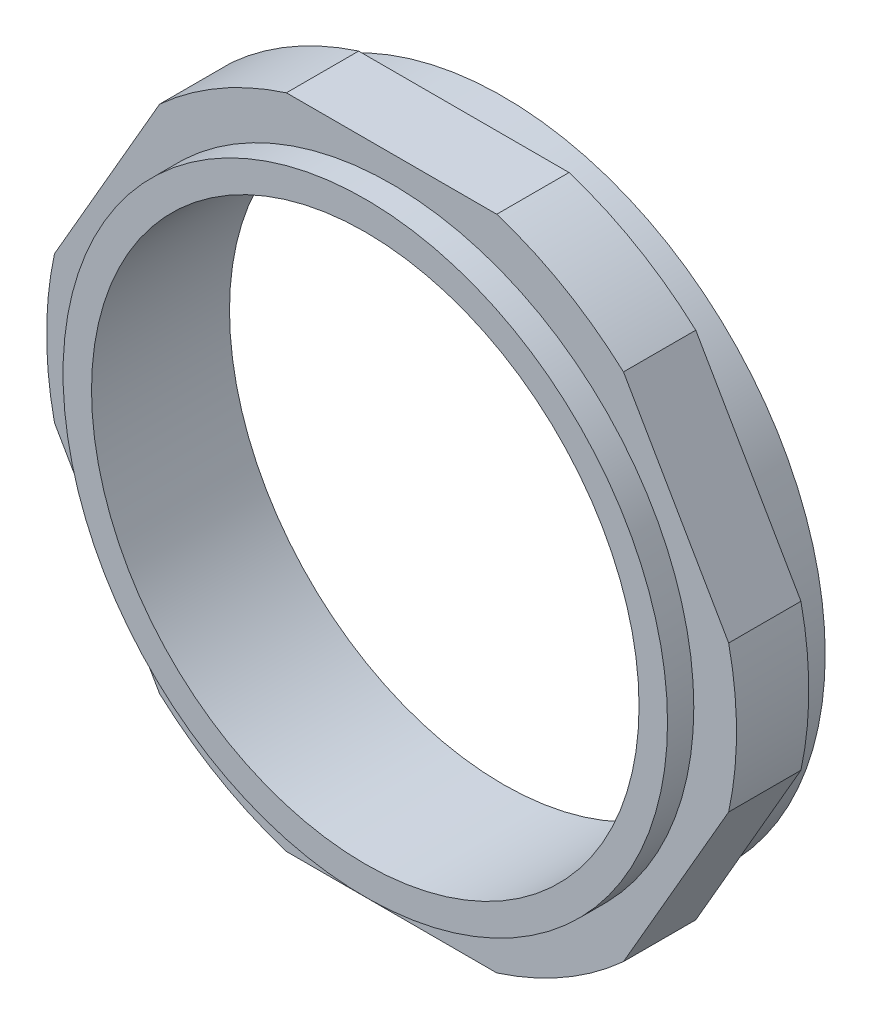
ISO-10303-21;
HEADER;
FILE_DESCRIPTION(('STEP AP214'),'2;1');
FILE_NAME('part.step','',(''),(''),'','','');
FILE_SCHEMA(('AUTOMOTIVE_DESIGN { 1 0 10303 214 1 1 1 1 }'));
ENDSEC;
DATA;
#1=APPLICATION_CONTEXT('core data for automotive mechanical design processes');
#2=APPLICATION_PROTOCOL_DEFINITION('international standard','automotive_design',2000,#1);
#3=PRODUCT_CONTEXT('',#1,'mechanical');
#4=PRODUCT('Part','Part','',(#3));
#5=PRODUCT_RELATED_PRODUCT_CATEGORY('part','',(#4));
#6=PRODUCT_DEFINITION_FORMATION('','',#4);
#7=PRODUCT_DEFINITION_CONTEXT('part definition',#1,'design');
#8=PRODUCT_DEFINITION('design','',#6,#7);
#9=PRODUCT_DEFINITION_SHAPE('','',#8);
#10=(LENGTH_UNIT() NAMED_UNIT(*) SI_UNIT(.MILLI.,.METRE.));
#11=(NAMED_UNIT(*) PLANE_ANGLE_UNIT() SI_UNIT($,.RADIAN.));
#12=(NAMED_UNIT(*) SI_UNIT($,.STERADIAN.) SOLID_ANGLE_UNIT());
#13=UNCERTAINTY_MEASURE_WITH_UNIT(LENGTH_MEASURE(1.E-05),#10,'distance_accuracy_value','');
#14=(GEOMETRIC_REPRESENTATION_CONTEXT(3) GLOBAL_UNCERTAINTY_ASSIGNED_CONTEXT((#13)) GLOBAL_UNIT_ASSIGNED_CONTEXT((#10,
#11,#12)) REPRESENTATION_CONTEXT('',''));
#15=CARTESIAN_POINT('',(0.,0.,0.));
#16=DIRECTION('',(0.,0.,1.));
#17=DIRECTION('',(1.,0.,0.));
#18=AXIS2_PLACEMENT_3D('',#15,#16,#17);
#19=CARTESIAN_POINT('',(0.,0.,1.8));
#20=DIRECTION('',(0.,0.,-1.));
#21=DIRECTION('',(1.,0.,0.));
#22=AXIS2_PLACEMENT_3D('',#19,#20,#21);
#23=CYLINDRICAL_SURFACE('',#22,29.4);
#24=CARTESIAN_POINT('',(0.,0.,0.));
#25=DIRECTION('',(0.,0.,-1.));
#26=DIRECTION('',(1.,0.,0.));
#27=AXIS2_PLACEMENT_3D('',#24,#25,#26);
#28=CIRCLE('',#27,29.4);
#29=CARTESIAN_POINT('',(29.4,0.,0.));
#30=VERTEX_POINT('',#29);
#31=EDGE_CURVE('E38',#30,#30,#28,.T.);
#32=ORIENTED_EDGE('',*,*,#31,.F.);
#33=EDGE_LOOP('',(#32));
#34=FACE_BOUND('',#33,.T.);
#35=CARTESIAN_POINT('',(0.,0.,3.6));
#36=DIRECTION('',(0.,0.,-1.));
#37=DIRECTION('',(1.,0.,0.));
#38=AXIS2_PLACEMENT_3D('',#35,#36,#37);
#39=CIRCLE('',#38,29.4);
#40=CARTESIAN_POINT('',(29.4,0.,3.6));
#41=VERTEX_POINT('',#40);
#42=EDGE_CURVE('E147',#41,#41,#39,.T.);
#43=ORIENTED_EDGE('',*,*,#42,.T.);
#44=EDGE_LOOP('',(#43));
#45=FACE_BOUND('',#44,.T.);
#46=ADVANCED_FACE('F34',(#34,#45),#23,.T.);
#47=CARTESIAN_POINT('',(0.,0.,3.6));
#48=DIRECTION('',(0.,0.,1.));
#49=DIRECTION('',(1.,0.,0.));
#50=AXIS2_PLACEMENT_3D('',#47,#48,#49);
#51=PLANE('',#50);
#52=ORIENTED_EDGE('',*,*,#42,.F.);
#53=EDGE_LOOP('',(#52));
#54=FACE_BOUND('',#53,.T.);
#55=CARTESIAN_POINT('',(0.,0.,3.6));
#56=DIRECTION('',(0.,0.,-1.));
#57=DIRECTION('',(1.,0.,0.));
#58=AXIS2_PLACEMENT_3D('',#55,#56,#57);
#59=CIRCLE('',#58,31.5);
#60=CARTESIAN_POINT('',(9.60468635614927,30.,3.6));
#61=VERTEX_POINT('',#60);
#62=CARTESIAN_POINT('',(21.1784189354586,23.317902379807,3.6));
#63=VERTEX_POINT('',#62);
#64=EDGE_CURVE('E56',#61,#63,#59,.T.);
#65=ORIENTED_EDGE('',*,*,#64,.T.);
#66=DIRECTION('',(-0.5,0.866025403784439,0.));
#67=VECTOR('',#66,1.);
#68=CARTESIAN_POINT('',(34.6410161513776,0.,3.6));
#69=LINE('',#68,#67);
#70=CARTESIAN_POINT('',(30.7831052916078,6.68209762019298,3.6));
#71=VERTEX_POINT('',#70);
#72=EDGE_CURVE('E245',#71,#63,#69,.T.);
#73=ORIENTED_EDGE('',*,*,#72,.F.);
#74=CARTESIAN_POINT('',(0.,0.,3.6));
#75=DIRECTION('',(0.,0.,-1.));
#76=DIRECTION('',(1.,0.,0.));
#77=AXIS2_PLACEMENT_3D('',#74,#75,#76);
#78=CIRCLE('',#77,31.5);
#79=CARTESIAN_POINT('',(30.7831052916078,-6.68209762019297,3.6));
#80=VERTEX_POINT('',#79);
#81=EDGE_CURVE('E250',#71,#80,#78,.T.);
#82=ORIENTED_EDGE('',*,*,#81,.T.);
#83=DIRECTION('',(0.5,0.866025403784438,0.));
#84=VECTOR('',#83,1.);
#85=CARTESIAN_POINT('',(17.3205080756888,-30.,3.6));
#86=LINE('',#85,#84);
#87=CARTESIAN_POINT('',(21.1784189354585,-23.3179023798071,3.6));
#88=VERTEX_POINT('',#87);
#89=EDGE_CURVE('E229',#88,#80,#86,.T.);
#90=ORIENTED_EDGE('',*,*,#89,.F.);
#91=CARTESIAN_POINT('',(0.,0.,3.6));
#92=DIRECTION('',(0.,0.,-1.));
#93=DIRECTION('',(1.,0.,0.));
#94=AXIS2_PLACEMENT_3D('',#91,#92,#93);
#95=CIRCLE('',#94,31.5);
#96=CARTESIAN_POINT('',(9.60468635614932,-30.,3.6));
#97=VERTEX_POINT('',#96);
#98=EDGE_CURVE('E100',#88,#97,#95,.T.);
#99=ORIENTED_EDGE('',*,*,#98,.T.);
#100=DIRECTION('',(1.,0.,0.));
#101=VECTOR('',#100,1.);
#102=CARTESIAN_POINT('',(-17.3205080756888,-30.,3.6));
#103=LINE('',#102,#101);
#104=CARTESIAN_POINT('',(-9.60468635614933,-30.,3.6));
#105=VERTEX_POINT('',#104);
#106=EDGE_CURVE('E214',#105,#97,#103,.T.);
#107=ORIENTED_EDGE('',*,*,#106,.F.);
#108=CARTESIAN_POINT('',(0.,0.,3.6));
#109=DIRECTION('',(0.,0.,-1.));
#110=DIRECTION('',(1.,0.,0.));
#111=AXIS2_PLACEMENT_3D('',#108,#109,#110);
#112=CIRCLE('',#111,31.5);
#113=CARTESIAN_POINT('',(-21.1784189354585,-23.3179023798071,3.6));
#114=VERTEX_POINT('',#113);
#115=EDGE_CURVE('E112',#105,#114,#112,.T.);
#116=ORIENTED_EDGE('',*,*,#115,.T.);
#117=DIRECTION('',(0.5,-0.866025403784439,0.));
#118=VECTOR('',#117,1.);
#119=CARTESIAN_POINT('',(-34.6410161513775,0.,3.6));
#120=LINE('',#119,#118);
#121=CARTESIAN_POINT('',(-30.7831052916078,-6.6820976201929,3.6));
#122=VERTEX_POINT('',#121);
#123=EDGE_CURVE('E198',#122,#114,#120,.T.);
#124=ORIENTED_EDGE('',*,*,#123,.F.);
#125=CARTESIAN_POINT('',(0.,0.,3.6));
#126=DIRECTION('',(0.,0.,-1.));
#127=DIRECTION('',(1.,0.,0.));
#128=AXIS2_PLACEMENT_3D('',#125,#126,#127);
#129=CIRCLE('',#128,31.5);
#130=CARTESIAN_POINT('',(-30.7831052916078,6.68209762019291,3.6));
#131=VERTEX_POINT('',#130);
#132=EDGE_CURVE('E148',#122,#131,#129,.T.);
#133=ORIENTED_EDGE('',*,*,#132,.T.);
#134=DIRECTION('',(-0.5,-0.866025403784439,0.));
#135=VECTOR('',#134,1.);
#136=CARTESIAN_POINT('',(-17.3205080756888,30.,3.6));
#137=LINE('',#136,#135);
#138=CARTESIAN_POINT('',(-21.1784189354585,23.3179023798071,3.6));
#139=VERTEX_POINT('',#138);
#140=EDGE_CURVE('E142',#139,#131,#137,.T.);
#141=ORIENTED_EDGE('',*,*,#140,.F.);
#142=CARTESIAN_POINT('',(0.,0.,3.6));
#143=DIRECTION('',(0.,0.,-1.));
#144=DIRECTION('',(1.,0.,0.));
#145=AXIS2_PLACEMENT_3D('',#142,#143,#144);
#146=CIRCLE('',#145,31.5);
#147=CARTESIAN_POINT('',(-9.60468635614927,30.,3.6));
#148=VERTEX_POINT('',#147);
#149=EDGE_CURVE('E134',#139,#148,#146,.T.);
#150=ORIENTED_EDGE('',*,*,#149,.T.);
#151=DIRECTION('',(-1.,0.,0.));
#152=VECTOR('',#151,1.);
#153=CARTESIAN_POINT('',(0.,30.,3.6));
#154=LINE('',#153,#152);
#155=EDGE_CURVE('E138',#61,#148,#154,.T.);
#156=ORIENTED_EDGE('',*,*,#155,.F.);
#157=EDGE_LOOP('',(#65,#73,#82,#90,#99,#107,#116,#124,#133,#141,#150,#156));
#158=FACE_BOUND('',#157,.T.);
#159=ADVANCED_FACE('F136',(#54,#158),#51,.F.);
#160=CARTESIAN_POINT('',(0.,0.,6.9));
#161=DIRECTION('',(0.,0.,1.));
#162=DIRECTION('',(1.,0.,0.));
#163=AXIS2_PLACEMENT_3D('',#160,#161,#162);
#164=CYLINDRICAL_SURFACE('',#163,31.5);
#165=DIRECTION('',(0.,0.,1.));
#166=VECTOR('',#165,1.);
#167=CARTESIAN_POINT('',(21.1784189354586,23.317902379807,6.9));
#168=LINE('',#167,#166);
#169=CARTESIAN_POINT('',(21.1784189354586,23.317902379807,10.2));
#170=VERTEX_POINT('',#169);
#171=EDGE_CURVE('E233',#63,#170,#168,.T.);
#172=ORIENTED_EDGE('',*,*,#171,.F.);
#173=ORIENTED_EDGE('',*,*,#64,.F.);
#174=DIRECTION('',(0.,0.,-1.));
#175=VECTOR('',#174,1.);
#176=CARTESIAN_POINT('',(9.60468635614927,30.,6.9));
#177=LINE('',#176,#175);
#178=CARTESIAN_POINT('',(9.60468635614927,30.,10.2));
#179=VERTEX_POINT('',#178);
#180=EDGE_CURVE('E163',#179,#61,#177,.T.);
#181=ORIENTED_EDGE('',*,*,#180,.F.);
#182=CARTESIAN_POINT('',(0.,0.,10.2));
#183=DIRECTION('',(0.,0.,1.));
#184=DIRECTION('',(1.,0.,0.));
#185=AXIS2_PLACEMENT_3D('',#182,#183,#184);
#186=CIRCLE('',#185,31.5);
#187=EDGE_CURVE('E357',#170,#179,#186,.T.);
#188=ORIENTED_EDGE('',*,*,#187,.F.);
#189=EDGE_LOOP('',(#172,#173,#181,#188));
#190=FACE_BOUND('',#189,.T.);
#191=ADVANCED_FACE('F276',(#190),#164,.T.);
#192=CARTESIAN_POINT('',(17.3205080756888,30.,3.6));
#193=DIRECTION('',(0.866025403784439,0.5,0.));
#194=DIRECTION('',(0.,0.,-1.));
#195=AXIS2_PLACEMENT_3D('',#192,#193,#194);
#196=PLANE('',#195);
#197=ORIENTED_EDGE('',*,*,#171,.T.);
#198=DIRECTION('',(0.5,-0.866025403784439,0.));
#199=VECTOR('',#198,1.);
#200=CARTESIAN_POINT('',(34.6410161513776,0.,10.2));
#201=LINE('',#200,#199);
#202=CARTESIAN_POINT('',(30.7831052916078,6.68209762019298,10.2));
#203=VERTEX_POINT('',#202);
#204=EDGE_CURVE('E237',#170,#203,#201,.T.);
#205=ORIENTED_EDGE('',*,*,#204,.T.);
#206=DIRECTION('',(0.,0.,-1.));
#207=VECTOR('',#206,1.);
#208=CARTESIAN_POINT('',(30.7831052916078,6.68209762019298,6.9));
#209=LINE('',#208,#207);
#210=EDGE_CURVE('E241',#203,#71,#209,.T.);
#211=ORIENTED_EDGE('',*,*,#210,.T.);
#212=ORIENTED_EDGE('',*,*,#72,.T.);
#213=EDGE_LOOP('',(#197,#205,#211,#212));
#214=FACE_BOUND('',#213,.T.);
#215=ADVANCED_FACE('F272',(#214),#196,.T.);
#216=CARTESIAN_POINT('',(0.,0.,6.9));
#217=DIRECTION('',(0.,0.,1.));
#218=DIRECTION('',(1.,0.,0.));
#219=AXIS2_PLACEMENT_3D('',#216,#217,#218);
#220=CYLINDRICAL_SURFACE('',#219,31.5);
#221=CARTESIAN_POINT('',(0.,0.,10.2));
#222=DIRECTION('',(0.,0.,1.));
#223=DIRECTION('',(1.,0.,0.));
#224=AXIS2_PLACEMENT_3D('',#221,#222,#223);
#225=CIRCLE('',#224,31.5);
#226=CARTESIAN_POINT('',(30.7831052916078,-6.68209762019297,10.2));
#227=VERTEX_POINT('',#226);
#228=EDGE_CURVE('E381',#227,#203,#225,.T.);
#229=ORIENTED_EDGE('',*,*,#228,.F.);
#230=DIRECTION('',(0.,0.,1.));
#231=VECTOR('',#230,1.);
#232=CARTESIAN_POINT('',(30.7831052916078,-6.68209762019297,6.9));
#233=LINE('',#232,#231);
#234=EDGE_CURVE('E217',#80,#227,#233,.T.);
#235=ORIENTED_EDGE('',*,*,#234,.F.);
#236=ORIENTED_EDGE('',*,*,#81,.F.);
#237=ORIENTED_EDGE('',*,*,#210,.F.);
#238=EDGE_LOOP('',(#229,#235,#236,#237));
#239=FACE_BOUND('',#238,.T.);
#240=ADVANCED_FACE('F282',(#239),#220,.T.);
#241=CARTESIAN_POINT('',(34.6410161513776,0.,3.6));
#242=DIRECTION('',(0.866025403784438,-0.5,0.));
#243=DIRECTION('',(0.,0.,-1.));
#244=AXIS2_PLACEMENT_3D('',#241,#242,#243);
#245=PLANE('',#244);
#246=ORIENTED_EDGE('',*,*,#234,.T.);
#247=DIRECTION('',(-0.5,-0.866025403784438,0.));
#248=VECTOR('',#247,1.);
#249=CARTESIAN_POINT('',(17.3205080756888,-30.,10.2));
#250=LINE('',#249,#248);
#251=CARTESIAN_POINT('',(21.1784189354585,-23.3179023798071,10.2));
#252=VERTEX_POINT('',#251);
#253=EDGE_CURVE('E221',#227,#252,#250,.T.);
#254=ORIENTED_EDGE('',*,*,#253,.T.);
#255=DIRECTION('',(0.,0.,-1.));
#256=VECTOR('',#255,1.);
#257=CARTESIAN_POINT('',(21.1784189354585,-23.3179023798071,6.9));
#258=LINE('',#257,#256);
#259=EDGE_CURVE('E225',#252,#88,#258,.T.);
#260=ORIENTED_EDGE('',*,*,#259,.T.);
#261=ORIENTED_EDGE('',*,*,#89,.T.);
#262=EDGE_LOOP('',(#246,#254,#260,#261));
#263=FACE_BOUND('',#262,.T.);
#264=ADVANCED_FACE('F284',(#263),#245,.T.);
#265=CARTESIAN_POINT('',(0.,0.,6.9));
#266=DIRECTION('',(0.,0.,1.));
#267=DIRECTION('',(1.,0.,0.));
#268=AXIS2_PLACEMENT_3D('',#265,#266,#267);
#269=CYLINDRICAL_SURFACE('',#268,31.5);
#270=DIRECTION('',(0.,0.,1.));
#271=VECTOR('',#270,1.);
#272=CARTESIAN_POINT('',(9.60468635614932,-30.,6.9));
#273=LINE('',#272,#271);
#274=CARTESIAN_POINT('',(9.60468635614932,-30.,10.2));
#275=VERTEX_POINT('',#274);
#276=EDGE_CURVE('E202',#97,#275,#273,.T.);
#277=ORIENTED_EDGE('',*,*,#276,.F.);
#278=ORIENTED_EDGE('',*,*,#98,.F.);
#279=ORIENTED_EDGE('',*,*,#259,.F.);
#280=CARTESIAN_POINT('',(0.,0.,10.2));
#281=DIRECTION('',(0.,0.,1.));
#282=DIRECTION('',(1.,0.,0.));
#283=AXIS2_PLACEMENT_3D('',#280,#281,#282);
#284=CIRCLE('',#283,31.5);
#285=EDGE_CURVE('E377',#275,#252,#284,.T.);
#286=ORIENTED_EDGE('',*,*,#285,.F.);
#287=EDGE_LOOP('',(#277,#278,#279,#286));
#288=FACE_BOUND('',#287,.T.);
#289=ADVANCED_FACE('F292',(#288),#269,.T.);
#290=CARTESIAN_POINT('',(17.3205080756888,-30.,3.6));
#291=DIRECTION('',(0.,-1.,0.));
#292=DIRECTION('',(-1.,0.,0.));
#293=AXIS2_PLACEMENT_3D('',#290,#291,#292);
#294=PLANE('',#293);
#295=ORIENTED_EDGE('',*,*,#276,.T.);
#296=DIRECTION('',(-1.,0.,0.));
#297=VECTOR('',#296,1.);
#298=CARTESIAN_POINT('',(-17.3205080756888,-30.,10.2));
#299=LINE('',#298,#297);
#300=CARTESIAN_POINT('',(-9.60468635614933,-30.,10.2));
#301=VERTEX_POINT('',#300);
#302=EDGE_CURVE('E206',#275,#301,#299,.T.);
#303=ORIENTED_EDGE('',*,*,#302,.T.);
#304=DIRECTION('',(0.,0.,-1.));
#305=VECTOR('',#304,1.);
#306=CARTESIAN_POINT('',(-9.60468635614933,-30.,6.9));
#307=LINE('',#306,#305);
#308=EDGE_CURVE('E210',#301,#105,#307,.T.);
#309=ORIENTED_EDGE('',*,*,#308,.T.);
#310=ORIENTED_EDGE('',*,*,#106,.T.);
#311=EDGE_LOOP('',(#295,#303,#309,#310));
#312=FACE_BOUND('',#311,.T.);
#313=ADVANCED_FACE('F299',(#312),#294,.T.);
#314=CARTESIAN_POINT('',(0.,0.,6.9));
#315=DIRECTION('',(0.,0.,1.));
#316=DIRECTION('',(1.,0.,0.));
#317=AXIS2_PLACEMENT_3D('',#314,#315,#316);
#318=CYLINDRICAL_SURFACE('',#317,31.5);
#319=DIRECTION('',(0.,0.,1.));
#320=VECTOR('',#319,1.);
#321=CARTESIAN_POINT('',(-21.1784189354585,-23.3179023798071,6.9));
#322=LINE('',#321,#320);
#323=CARTESIAN_POINT('',(-21.1784189354585,-23.3179023798071,10.2));
#324=VERTEX_POINT('',#323);
#325=EDGE_CURVE('E186',#114,#324,#322,.T.);
#326=ORIENTED_EDGE('',*,*,#325,.F.);
#327=ORIENTED_EDGE('',*,*,#115,.F.);
#328=ORIENTED_EDGE('',*,*,#308,.F.);
#329=CARTESIAN_POINT('',(0.,0.,10.2));
#330=DIRECTION('',(0.,0.,1.));
#331=DIRECTION('',(1.,0.,0.));
#332=AXIS2_PLACEMENT_3D('',#329,#330,#331);
#333=CIRCLE('',#332,31.5);
#334=EDGE_CURVE('E373',#324,#301,#333,.T.);
#335=ORIENTED_EDGE('',*,*,#334,.F.);
#336=EDGE_LOOP('',(#326,#327,#328,#335));
#337=FACE_BOUND('',#336,.T.);
#338=ADVANCED_FACE('F305',(#337),#318,.T.);
#339=CARTESIAN_POINT('',(-17.3205080756888,-30.,3.6));
#340=DIRECTION('',(-0.866025403784439,-0.5,0.));
#341=DIRECTION('',(-0.5,0.866025403784439,0.));
#342=AXIS2_PLACEMENT_3D('',#339,#340,#341);
#343=PLANE('',#342);
#344=ORIENTED_EDGE('',*,*,#325,.T.);
#345=DIRECTION('',(-0.5,0.866025403784439,0.));
#346=VECTOR('',#345,1.);
#347=CARTESIAN_POINT('',(-34.6410161513775,0.,10.2));
#348=LINE('',#347,#346);
#349=CARTESIAN_POINT('',(-30.7831052916078,-6.6820976201929,10.2));
#350=VERTEX_POINT('',#349);
#351=EDGE_CURVE('E190',#324,#350,#348,.T.);
#352=ORIENTED_EDGE('',*,*,#351,.T.);
#353=DIRECTION('',(0.,0.,-1.));
#354=VECTOR('',#353,1.);
#355=CARTESIAN_POINT('',(-30.7831052916078,-6.6820976201929,6.9));
#356=LINE('',#355,#354);
#357=EDGE_CURVE('E194',#350,#122,#356,.T.);
#358=ORIENTED_EDGE('',*,*,#357,.T.);
#359=ORIENTED_EDGE('',*,*,#123,.T.);
#360=EDGE_LOOP('',(#344,#352,#358,#359));
#361=FACE_BOUND('',#360,.T.);
#362=ADVANCED_FACE('F309',(#361),#343,.T.);
#363=CARTESIAN_POINT('',(0.,0.,6.9));
#364=DIRECTION('',(0.,0.,1.));
#365=DIRECTION('',(1.,0.,0.));
#366=AXIS2_PLACEMENT_3D('',#363,#364,#365);
#367=CYLINDRICAL_SURFACE('',#366,31.5);
#368=CARTESIAN_POINT('',(0.,0.,10.2));
#369=DIRECTION('',(0.,0.,1.));
#370=DIRECTION('',(1.,0.,0.));
#371=AXIS2_PLACEMENT_3D('',#368,#369,#370);
#372=CIRCLE('',#371,31.5);
#373=CARTESIAN_POINT('',(-30.7831052916078,6.68209762019291,10.2));
#374=VERTEX_POINT('',#373);
#375=EDGE_CURVE('E369',#374,#350,#372,.T.);
#376=ORIENTED_EDGE('',*,*,#375,.F.);
#377=DIRECTION('',(0.,0.,1.));
#378=VECTOR('',#377,1.);
#379=CARTESIAN_POINT('',(-30.7831052916078,6.68209762019291,6.9));
#380=LINE('',#379,#378);
#381=EDGE_CURVE('E179',#131,#374,#380,.T.);
#382=ORIENTED_EDGE('',*,*,#381,.F.);
#383=ORIENTED_EDGE('',*,*,#132,.F.);
#384=ORIENTED_EDGE('',*,*,#357,.F.);
#385=EDGE_LOOP('',(#376,#382,#383,#384));
#386=FACE_BOUND('',#385,.T.);
#387=ADVANCED_FACE('F314',(#386),#367,.T.);
#388=CARTESIAN_POINT('',(-34.6410161513775,0.,3.6));
#389=DIRECTION('',(-0.866025403784439,0.5,0.));
#390=DIRECTION('',(0.,0.,1.));
#391=AXIS2_PLACEMENT_3D('',#388,#389,#390);
#392=PLANE('',#391);
#393=DIRECTION('',(0.,0.,-1.));
#394=VECTOR('',#393,1.);
#395=CARTESIAN_POINT('',(-21.1784189354585,23.3179023798071,6.9));
#396=LINE('',#395,#394);
#397=CARTESIAN_POINT('',(-21.1784189354585,23.3179023798071,10.2));
#398=VERTEX_POINT('',#397);
#399=EDGE_CURVE('E174',#398,#139,#396,.T.);
#400=ORIENTED_EDGE('',*,*,#399,.T.);
#401=ORIENTED_EDGE('',*,*,#140,.T.);
#402=ORIENTED_EDGE('',*,*,#381,.T.);
#403=DIRECTION('',(0.5,0.866025403784439,0.));
#404=VECTOR('',#403,1.);
#405=CARTESIAN_POINT('',(-17.3205080756888,30.,10.2));
#406=LINE('',#405,#404);
#407=EDGE_CURVE('E183',#374,#398,#406,.T.);
#408=ORIENTED_EDGE('',*,*,#407,.T.);
#409=EDGE_LOOP('',(#400,#401,#402,#408));
#410=FACE_BOUND('',#409,.T.);
#411=ADVANCED_FACE('F318',(#410),#392,.T.);
#412=CARTESIAN_POINT('',(0.,0.,6.9));
#413=DIRECTION('',(0.,0.,1.));
#414=DIRECTION('',(1.,0.,0.));
#415=AXIS2_PLACEMENT_3D('',#412,#413,#414);
#416=CYLINDRICAL_SURFACE('',#415,31.5);
#417=ORIENTED_EDGE('',*,*,#399,.F.);
#418=CARTESIAN_POINT('',(0.,0.,10.2));
#419=DIRECTION('',(0.,0.,1.));
#420=DIRECTION('',(1.,0.,0.));
#421=AXIS2_PLACEMENT_3D('',#418,#419,#420);
#422=CIRCLE('',#421,31.5);
#423=CARTESIAN_POINT('',(-9.60468635614927,30.,10.2));
#424=VERTEX_POINT('',#423);
#425=EDGE_CURVE('E155',#424,#398,#422,.T.);
#426=ORIENTED_EDGE('',*,*,#425,.F.);
#427=DIRECTION('',(0.,0.,1.));
#428=VECTOR('',#427,1.);
#429=CARTESIAN_POINT('',(-9.60468635614927,30.,6.9));
#430=LINE('',#429,#428);
#431=EDGE_CURVE('E152',#148,#424,#430,.T.);
#432=ORIENTED_EDGE('',*,*,#431,.F.);
#433=ORIENTED_EDGE('',*,*,#149,.F.);
#434=EDGE_LOOP('',(#417,#426,#432,#433));
#435=FACE_BOUND('',#434,.T.);
#436=ADVANCED_FACE('F153',(#435),#416,.T.);
#437=CARTESIAN_POINT('',(0.,30.,3.6));
#438=DIRECTION('',(0.,1.,0.));
#439=DIRECTION('',(1.,0.,0.));
#440=AXIS2_PLACEMENT_3D('',#437,#438,#439);
#441=PLANE('',#440);
#442=ORIENTED_EDGE('',*,*,#180,.T.);
#443=ORIENTED_EDGE('',*,*,#155,.T.);
#444=ORIENTED_EDGE('',*,*,#431,.T.);
#445=DIRECTION('',(1.,0.,0.));
#446=VECTOR('',#445,1.);
#447=CARTESIAN_POINT('',(17.3205080756888,30.,10.2));
#448=LINE('',#447,#446);
#449=EDGE_CURVE('E159',#424,#179,#448,.T.);
#450=ORIENTED_EDGE('',*,*,#449,.T.);
#451=EDGE_LOOP('',(#442,#443,#444,#450));
#452=FACE_BOUND('',#451,.T.);
#453=ADVANCED_FACE('F161',(#452),#441,.T.);
#454=CARTESIAN_POINT('',(0.,0.,10.2));
#455=DIRECTION('',(0.,0.,1.));
#456=DIRECTION('',(1.,0.,0.));
#457=AXIS2_PLACEMENT_3D('',#454,#455,#456);
#458=PLANE('',#457);
#459=CARTESIAN_POINT('',(0.,0.,10.2));
#460=DIRECTION('',(0.,0.,-1.));
#461=DIRECTION('',(1.,0.,0.));
#462=AXIS2_PLACEMENT_3D('',#459,#460,#461);
#463=CIRCLE('',#462,27.6);
#464=CARTESIAN_POINT('',(27.6,0.,10.2));
#465=VERTEX_POINT('',#464);
#466=EDGE_CURVE('E168',#465,#465,#463,.T.);
#467=ORIENTED_EDGE('',*,*,#466,.T.);
#468=EDGE_LOOP('',(#467));
#469=FACE_BOUND('',#468,.T.);
#470=ORIENTED_EDGE('',*,*,#187,.T.);
#471=ORIENTED_EDGE('',*,*,#449,.F.);
#472=ORIENTED_EDGE('',*,*,#425,.T.);
#473=ORIENTED_EDGE('',*,*,#407,.F.);
#474=ORIENTED_EDGE('',*,*,#375,.T.);
#475=ORIENTED_EDGE('',*,*,#351,.F.);
#476=ORIENTED_EDGE('',*,*,#334,.T.);
#477=ORIENTED_EDGE('',*,*,#302,.F.);
#478=ORIENTED_EDGE('',*,*,#285,.T.);
#479=ORIENTED_EDGE('',*,*,#253,.F.);
#480=ORIENTED_EDGE('',*,*,#228,.T.);
#481=ORIENTED_EDGE('',*,*,#204,.F.);
#482=EDGE_LOOP('',(#470,#471,#472,#473,#474,#475,#476,#477,#478,#479,#480,#481));
#483=FACE_BOUND('',#482,.T.);
#484=ADVANCED_FACE('F295',(#469,#483),#458,.T.);
#485=CARTESIAN_POINT('',(0.,0.,11.4));
#486=DIRECTION('',(0.,0.,-1.));
#487=DIRECTION('',(1.,0.,0.));
#488=AXIS2_PLACEMENT_3D('',#485,#486,#487);
#489=CYLINDRICAL_SURFACE('',#488,27.6);
#490=ORIENTED_EDGE('',*,*,#466,.F.);
#491=EDGE_LOOP('',(#490));
#492=FACE_BOUND('',#491,.T.);
#493=CARTESIAN_POINT('',(0.,0.,12.6));
#494=DIRECTION('',(0.,0.,-1.));
#495=DIRECTION('',(1.,0.,0.));
#496=AXIS2_PLACEMENT_3D('',#493,#494,#495);
#497=CIRCLE('',#496,27.6);
#498=CARTESIAN_POINT('',(27.6,0.,12.6));
#499=VERTEX_POINT('',#498);
#500=EDGE_CURVE('E358',#499,#499,#497,.T.);
#501=ORIENTED_EDGE('',*,*,#500,.T.);
#502=EDGE_LOOP('',(#501));
#503=FACE_BOUND('',#502,.T.);
#504=ADVANCED_FACE('F279',(#492,#503),#489,.T.);
#505=CARTESIAN_POINT('',(0.,0.,-98.9949493661167));
#506=DIRECTION('',(0.,0.,1.));
#507=DIRECTION('',(1.,0.,0.));
#508=AXIS2_PLACEMENT_3D('',#505,#506,#507);
#509=CYLINDRICAL_SURFACE('',#508,25.);
#510=CARTESIAN_POINT('',(0.,0.,0.));
#511=DIRECTION('',(0.,0.,-1.));
#512=DIRECTION('',(-1.,0.,0.));
#513=AXIS2_PLACEMENT_3D('',#510,#511,#512);
#514=CIRCLE('',#513,25.);
#515=CARTESIAN_POINT('',(-25.,0.,0.));
#516=VERTEX_POINT('',#515);
#517=EDGE_CURVE('E11',#516,#516,#514,.F.);
#518=ORIENTED_EDGE('',*,*,#517,.F.);
#519=EDGE_LOOP('',(#518));
#520=FACE_BOUND('',#519,.T.);
#521=CARTESIAN_POINT('',(0.,0.,12.6));
#522=DIRECTION('',(0.,0.,-1.));
#523=DIRECTION('',(-1.,0.,0.));
#524=AXIS2_PLACEMENT_3D('',#521,#522,#523);
#525=CIRCLE('',#524,25.);
#526=CARTESIAN_POINT('',(-25.,0.,12.6));
#527=VERTEX_POINT('',#526);
#528=EDGE_CURVE('E356',#527,#527,#525,.T.);
#529=ORIENTED_EDGE('',*,*,#528,.F.);
#530=EDGE_LOOP('',(#529));
#531=FACE_BOUND('',#530,.T.);
#532=ADVANCED_FACE('F340',(#520,#531),#509,.F.);
#533=CARTESIAN_POINT('',(14.7,0.,0.));
#534=DIRECTION('',(0.,0.,-1.));
#535=DIRECTION('',(0.,-1.,0.));
#536=AXIS2_PLACEMENT_3D('',#533,#534,#535);
#537=PLANE('',#536);
#538=ORIENTED_EDGE('',*,*,#517,.T.);
#539=EDGE_LOOP('',(#538));
#540=FACE_BOUND('',#539,.T.);
#541=ORIENTED_EDGE('',*,*,#31,.T.);
#542=EDGE_LOOP('',(#541));
#543=FACE_BOUND('',#542,.T.);
#544=ADVANCED_FACE('F36',(#540,#543),#537,.T.);
#545=CARTESIAN_POINT('',(13.8,0.,12.6));
#546=DIRECTION('',(0.,0.,1.));
#547=DIRECTION('',(1.,0.,0.));
#548=AXIS2_PLACEMENT_3D('',#545,#546,#547);
#549=PLANE('',#548);
#550=ORIENTED_EDGE('',*,*,#528,.T.);
#551=EDGE_LOOP('',(#550));
#552=FACE_BOUND('',#551,.T.);
#553=ORIENTED_EDGE('',*,*,#500,.F.);
#554=EDGE_LOOP('',(#553));
#555=FACE_BOUND('',#554,.T.);
#556=ADVANCED_FACE('F291',(#552,#555),#549,.T.);
#557=CLOSED_SHELL('',(#46,#159,#191,#215,#240,#264,#289,#313,#338,#362,#387,#411,#436,#453,#484,
#504,#532,#544,#556));
#558=MANIFOLD_SOLID_BREP('B2',#557);
#559=ADVANCED_BREP_SHAPE_REPRESENTATION('',(#18,#558),#14);
#560=SHAPE_DEFINITION_REPRESENTATION(#9,#559);
ENDSEC;
END-ISO-10303-21;
